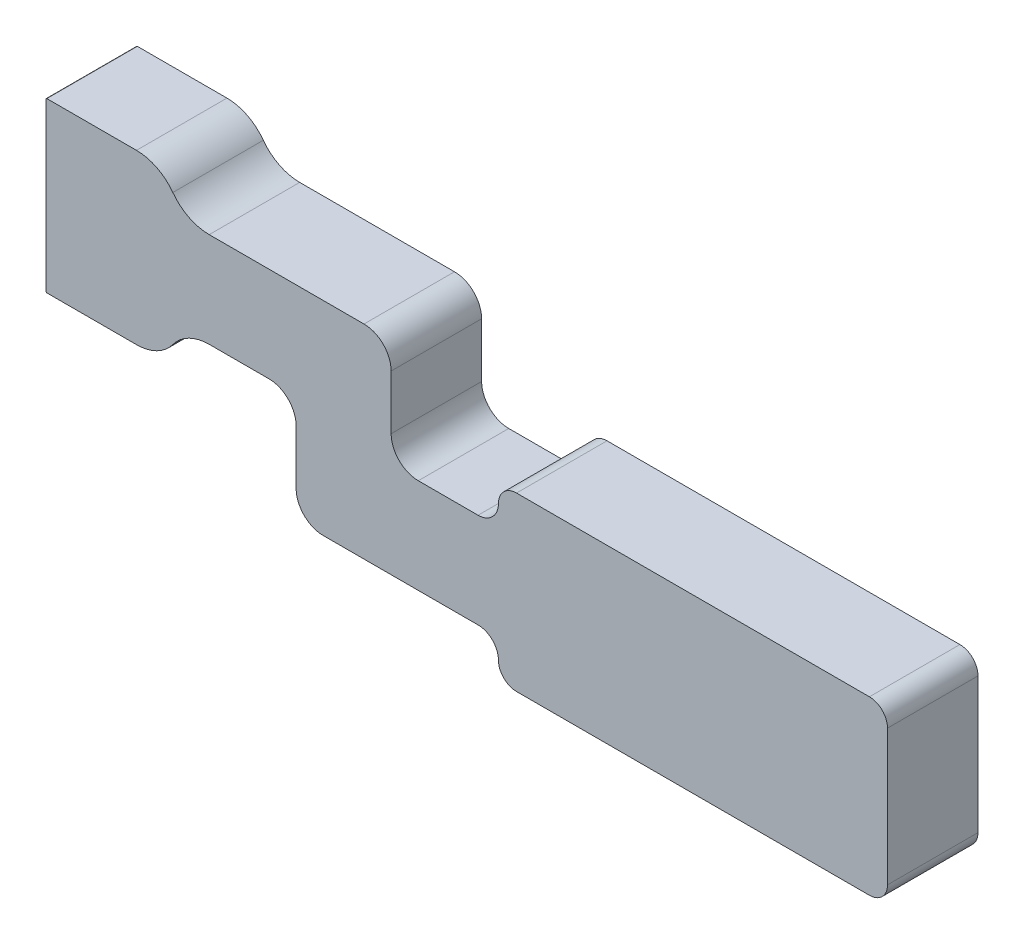
ISO-10303-21;
HEADER;
FILE_DESCRIPTION(('STEP AP214'),'2;1');
FILE_NAME('part.step','',(''),(''),'','','');
FILE_SCHEMA(('AUTOMOTIVE_DESIGN { 1 0 10303 214 1 1 1 1 }'));
ENDSEC;
DATA;
#1=APPLICATION_CONTEXT('core data for automotive mechanical design processes');
#2=APPLICATION_PROTOCOL_DEFINITION('international standard','automotive_design',2000,#1);
#3=PRODUCT_CONTEXT('',#1,'mechanical');
#4=PRODUCT('Part','Part','',(#3));
#5=PRODUCT_RELATED_PRODUCT_CATEGORY('part','',(#4));
#6=PRODUCT_DEFINITION_FORMATION('','',#4);
#7=PRODUCT_DEFINITION_CONTEXT('part definition',#1,'design');
#8=PRODUCT_DEFINITION('design','',#6,#7);
#9=PRODUCT_DEFINITION_SHAPE('','',#8);
#10=(LENGTH_UNIT() NAMED_UNIT(*) SI_UNIT(.MILLI.,.METRE.));
#11=(NAMED_UNIT(*) PLANE_ANGLE_UNIT() SI_UNIT($,.RADIAN.));
#12=(NAMED_UNIT(*) SI_UNIT($,.STERADIAN.) SOLID_ANGLE_UNIT());
#13=UNCERTAINTY_MEASURE_WITH_UNIT(LENGTH_MEASURE(1.E-05),#10,'distance_accuracy_value','');
#14=(GEOMETRIC_REPRESENTATION_CONTEXT(3) GLOBAL_UNCERTAINTY_ASSIGNED_CONTEXT((#13)) GLOBAL_UNIT_ASSIGNED_CONTEXT((#10,
#11,#12)) REPRESENTATION_CONTEXT('',''));
#15=CARTESIAN_POINT('',(0.,0.,0.));
#16=DIRECTION('',(0.,0.,1.));
#17=DIRECTION('',(1.,0.,0.));
#18=AXIS2_PLACEMENT_3D('',#15,#16,#17);
#19=CARTESIAN_POINT('',(0.,21.3,10.));
#20=DIRECTION('',(0.,-1.,0.));
#21=DIRECTION('',(0.,0.,-1.));
#22=AXIS2_PLACEMENT_3D('',#19,#20,#21);
#23=PLANE('',#22);
#24=DIRECTION('',(-1.,0.,0.));
#25=VECTOR('',#24,1.);
#26=CARTESIAN_POINT('',(0.,21.3,0.));
#27=LINE('',#26,#25);
#28=CARTESIAN_POINT('',(-83.,21.3,0.));
#29=VERTEX_POINT('',#28);
#30=CARTESIAN_POINT('',(-92.9,21.3,0.));
#31=VERTEX_POINT('',#30);
#32=EDGE_CURVE('E253',#29,#31,#27,.T.);
#33=ORIENTED_EDGE('',*,*,#32,.T.);
#34=DIRECTION('',(0.,0.,-1.));
#35=VECTOR('',#34,1.);
#36=CARTESIAN_POINT('',(-92.9,21.3,10.));
#37=LINE('',#36,#35);
#38=CARTESIAN_POINT('',(-92.9,21.3,10.));
#39=VERTEX_POINT('',#38);
#40=EDGE_CURVE('E11',#39,#31,#37,.T.);
#41=ORIENTED_EDGE('',*,*,#40,.F.);
#42=DIRECTION('',(-1.,0.,0.));
#43=VECTOR('',#42,1.);
#44=CARTESIAN_POINT('',(0.,21.3,10.));
#45=LINE('',#44,#43);
#46=CARTESIAN_POINT('',(-83.,21.3,10.));
#47=VERTEX_POINT('',#46);
#48=EDGE_CURVE('E322',#47,#39,#45,.T.);
#49=ORIENTED_EDGE('',*,*,#48,.F.);
#50=DIRECTION('',(0.,0.,-1.));
#51=VECTOR('',#50,1.);
#52=CARTESIAN_POINT('',(-83.,21.3,10.));
#53=LINE('',#52,#51);
#54=EDGE_CURVE('E252',#47,#29,#53,.T.);
#55=ORIENTED_EDGE('',*,*,#54,.T.);
#56=EDGE_LOOP('',(#33,#41,#49,#55));
#57=FACE_BOUND('',#56,.T.);
#58=ADVANCED_FACE('F39',(#57),#23,.F.);
#59=CARTESIAN_POINT('',(-92.9,21.2,10.));
#60=DIRECTION('',(0.,0.,-1.));
#61=DIRECTION('',(-1.,0.,0.));
#62=AXIS2_PLACEMENT_3D('',#59,#60,#61);
#63=CYLINDRICAL_SURFACE('',#62,0.100000000000008);
#64=CARTESIAN_POINT('',(-92.9,21.2,0.));
#65=DIRECTION('',(0.,0.,1.));
#66=DIRECTION('',(1.,0.,0.));
#67=AXIS2_PLACEMENT_3D('',#64,#65,#66);
#68=CIRCLE('',#67,0.100000000000008);
#69=CARTESIAN_POINT('',(-93.,21.2,0.));
#70=VERTEX_POINT('',#69);
#71=EDGE_CURVE('E256',#31,#70,#68,.T.);
#72=ORIENTED_EDGE('',*,*,#71,.T.);
#73=DIRECTION('',(0.,0.,-1.));
#74=VECTOR('',#73,1.);
#75=CARTESIAN_POINT('',(-93.,21.2,10.));
#76=LINE('',#75,#74);
#77=CARTESIAN_POINT('',(-93.,21.2,10.));
#78=VERTEX_POINT('',#77);
#79=EDGE_CURVE('E50',#78,#70,#76,.T.);
#80=ORIENTED_EDGE('',*,*,#79,.F.);
#81=CARTESIAN_POINT('',(-92.9,21.2,10.));
#82=DIRECTION('',(0.,0.,1.));
#83=DIRECTION('',(1.,0.,0.));
#84=AXIS2_PLACEMENT_3D('',#81,#82,#83);
#85=CIRCLE('',#84,0.100000000000008);
#86=EDGE_CURVE('E156',#39,#78,#85,.T.);
#87=ORIENTED_EDGE('',*,*,#86,.F.);
#88=ORIENTED_EDGE('',*,*,#40,.T.);
#89=EDGE_LOOP('',(#72,#80,#87,#88));
#90=FACE_BOUND('',#89,.T.);
#91=ADVANCED_FACE('F471',(#90),#63,.T.);
#92=CARTESIAN_POINT('',(-93.,0.,10.));
#93=DIRECTION('',(1.,0.,0.));
#94=DIRECTION('',(0.,0.,-1.));
#95=AXIS2_PLACEMENT_3D('',#92,#93,#94);
#96=PLANE('',#95);
#97=DIRECTION('',(0.,-1.,0.));
#98=VECTOR('',#97,1.);
#99=CARTESIAN_POINT('',(-93.,0.,0.));
#100=LINE('',#99,#98);
#101=CARTESIAN_POINT('',(-93.,2.80000000000004,0.));
#102=VERTEX_POINT('',#101);
#103=EDGE_CURVE('E259',#70,#102,#100,.T.);
#104=ORIENTED_EDGE('',*,*,#103,.T.);
#105=DIRECTION('',(0.,0.,-1.));
#106=VECTOR('',#105,1.);
#107=CARTESIAN_POINT('',(-93.,2.80000000000004,10.));
#108=LINE('',#107,#106);
#109=CARTESIAN_POINT('',(-93.,2.80000000000004,10.));
#110=VERTEX_POINT('',#109);
#111=EDGE_CURVE('E379',#110,#102,#108,.T.);
#112=ORIENTED_EDGE('',*,*,#111,.F.);
#113=DIRECTION('',(0.,-1.,0.));
#114=VECTOR('',#113,1.);
#115=CARTESIAN_POINT('',(-93.,0.,10.));
#116=LINE('',#115,#114);
#117=EDGE_CURVE('E384',#78,#110,#116,.T.);
#118=ORIENTED_EDGE('',*,*,#117,.F.);
#119=ORIENTED_EDGE('',*,*,#79,.T.);
#120=EDGE_LOOP('',(#104,#112,#118,#119));
#121=FACE_BOUND('',#120,.T.);
#122=ADVANCED_FACE('F385',(#121),#96,.F.);
#123=CARTESIAN_POINT('',(-92.9,2.80000000000004,10.));
#124=DIRECTION('',(0.,0.,-1.));
#125=DIRECTION('',(-1.,0.,0.));
#126=AXIS2_PLACEMENT_3D('',#123,#124,#125);
#127=CYLINDRICAL_SURFACE('',#126,0.100000000000008);
#128=CARTESIAN_POINT('',(-92.9,2.80000000000004,0.));
#129=DIRECTION('',(0.,0.,1.));
#130=DIRECTION('',(1.,0.,0.));
#131=AXIS2_PLACEMENT_3D('',#128,#129,#130);
#132=CIRCLE('',#131,0.100000000000008);
#133=CARTESIAN_POINT('',(-92.9,2.70000000000004,0.));
#134=VERTEX_POINT('',#133);
#135=EDGE_CURVE('E261',#134,#102,#132,.F.);
#136=ORIENTED_EDGE('',*,*,#135,.F.);
#137=DIRECTION('',(0.,0.,-1.));
#138=VECTOR('',#137,1.);
#139=CARTESIAN_POINT('',(-92.9,2.70000000000004,10.));
#140=LINE('',#139,#138);
#141=CARTESIAN_POINT('',(-92.9,2.70000000000004,10.));
#142=VERTEX_POINT('',#141);
#143=EDGE_CURVE('E373',#142,#134,#140,.T.);
#144=ORIENTED_EDGE('',*,*,#143,.F.);
#145=CARTESIAN_POINT('',(-92.9,2.80000000000004,10.));
#146=DIRECTION('',(0.,0.,1.));
#147=DIRECTION('',(1.,0.,0.));
#148=AXIS2_PLACEMENT_3D('',#145,#146,#147);
#149=CIRCLE('',#148,0.100000000000008);
#150=EDGE_CURVE('E395',#142,#110,#149,.F.);
#151=ORIENTED_EDGE('',*,*,#150,.T.);
#152=ORIENTED_EDGE('',*,*,#111,.T.);
#153=EDGE_LOOP('',(#136,#144,#151,#152));
#154=FACE_BOUND('',#153,.T.);
#155=ADVANCED_FACE('F393',(#154),#127,.T.);
#156=CARTESIAN_POINT('',(0.,2.70000000000005,10.));
#157=DIRECTION('',(0.,-1.,0.));
#158=DIRECTION('',(1.,0.,0.));
#159=AXIS2_PLACEMENT_3D('',#156,#157,#158);
#160=PLANE('',#159);
#161=DIRECTION('',(-1.,0.,0.));
#162=VECTOR('',#161,1.);
#163=CARTESIAN_POINT('',(0.,2.70000000000005,0.));
#164=LINE('',#163,#162);
#165=CARTESIAN_POINT('',(-83.,2.70000000000004,0.));
#166=VERTEX_POINT('',#165);
#167=EDGE_CURVE('E266',#166,#134,#164,.T.);
#168=ORIENTED_EDGE('',*,*,#167,.F.);
#169=DIRECTION('',(0.,0.,-1.));
#170=VECTOR('',#169,1.);
#171=CARTESIAN_POINT('',(-83.,2.70000000000004,10.));
#172=LINE('',#171,#170);
#173=CARTESIAN_POINT('',(-83.,2.70000000000004,10.));
#174=VERTEX_POINT('',#173);
#175=EDGE_CURVE('E374',#174,#166,#172,.T.);
#176=ORIENTED_EDGE('',*,*,#175,.F.);
#177=DIRECTION('',(-1.,0.,0.));
#178=VECTOR('',#177,1.);
#179=CARTESIAN_POINT('',(0.,2.70000000000005,10.));
#180=LINE('',#179,#178);
#181=EDGE_CURVE('E400',#174,#142,#180,.T.);
#182=ORIENTED_EDGE('',*,*,#181,.T.);
#183=ORIENTED_EDGE('',*,*,#143,.T.);
#184=EDGE_LOOP('',(#168,#176,#182,#183));
#185=FACE_BOUND('',#184,.T.);
#186=ADVANCED_FACE('F485',(#185),#160,.T.);
#187=CARTESIAN_POINT('',(-83.,7.70000000000004,10.));
#188=DIRECTION('',(0.,0.,-1.));
#189=DIRECTION('',(-1.,0.,0.));
#190=AXIS2_PLACEMENT_3D('',#187,#188,#189);
#191=CYLINDRICAL_SURFACE('',#190,5.00000000000001);
#192=CARTESIAN_POINT('',(-83.,7.70000000000004,0.));
#193=DIRECTION('',(0.,0.,1.));
#194=DIRECTION('',(1.,0.,0.));
#195=AXIS2_PLACEMENT_3D('',#192,#193,#194);
#196=CIRCLE('',#195,5.00000000000001);
#197=CARTESIAN_POINT('',(-78.9813715026144,4.72500000000004,0.));
#198=VERTEX_POINT('',#197);
#199=EDGE_CURVE('E267',#198,#166,#196,.F.);
#200=ORIENTED_EDGE('',*,*,#199,.F.);
#201=DIRECTION('',(0.,0.,-1.));
#202=VECTOR('',#201,1.);
#203=CARTESIAN_POINT('',(-78.9813715026144,4.72500000000004,10.));
#204=LINE('',#203,#202);
#205=CARTESIAN_POINT('',(-78.9813715026144,4.72500000000004,10.));
#206=VERTEX_POINT('',#205);
#207=EDGE_CURVE('E372',#206,#198,#204,.T.);
#208=ORIENTED_EDGE('',*,*,#207,.F.);
#209=CARTESIAN_POINT('',(-83.,7.70000000000004,10.));
#210=DIRECTION('',(0.,0.,1.));
#211=DIRECTION('',(1.,0.,0.));
#212=AXIS2_PLACEMENT_3D('',#209,#210,#211);
#213=CIRCLE('',#212,5.00000000000001);
#214=EDGE_CURVE('E399',#206,#174,#213,.F.);
#215=ORIENTED_EDGE('',*,*,#214,.T.);
#216=ORIENTED_EDGE('',*,*,#175,.T.);
#217=EDGE_LOOP('',(#200,#208,#215,#216));
#218=FACE_BOUND('',#217,.T.);
#219=ADVANCED_FACE('F490',(#218),#191,.T.);
#220=CARTESIAN_POINT('',(-74.9627430052287,1.75000000000004,10.));
#221=DIRECTION('',(0.,0.,-1.));
#222=DIRECTION('',(-1.,0.,0.));
#223=AXIS2_PLACEMENT_3D('',#220,#221,#222);
#224=CYLINDRICAL_SURFACE('',#223,4.99999999999999);
#225=CARTESIAN_POINT('',(-74.9627430052287,1.75000000000004,0.));
#226=DIRECTION('',(0.,0.,1.));
#227=DIRECTION('',(1.,0.,0.));
#228=AXIS2_PLACEMENT_3D('',#225,#226,#227);
#229=CIRCLE('',#228,4.99999999999999);
#230=CARTESIAN_POINT('',(-74.9627430052287,6.75000000000003,0.));
#231=VERTEX_POINT('',#230);
#232=EDGE_CURVE('E275',#231,#198,#229,.T.);
#233=ORIENTED_EDGE('',*,*,#232,.F.);
#234=DIRECTION('',(0.,0.,-1.));
#235=VECTOR('',#234,1.);
#236=CARTESIAN_POINT('',(-74.9627430052287,6.75000000000003,10.));
#237=LINE('',#236,#235);
#238=CARTESIAN_POINT('',(-74.9627430052287,6.75000000000003,10.));
#239=VERTEX_POINT('',#238);
#240=EDGE_CURVE('E368',#239,#231,#237,.T.);
#241=ORIENTED_EDGE('',*,*,#240,.F.);
#242=CARTESIAN_POINT('',(-74.9627430052287,1.75000000000004,10.));
#243=DIRECTION('',(0.,0.,1.));
#244=DIRECTION('',(1.,0.,0.));
#245=AXIS2_PLACEMENT_3D('',#242,#243,#244);
#246=CIRCLE('',#245,4.99999999999999);
#247=EDGE_CURVE('E406',#239,#206,#246,.T.);
#248=ORIENTED_EDGE('',*,*,#247,.T.);
#249=ORIENTED_EDGE('',*,*,#207,.T.);
#250=EDGE_LOOP('',(#233,#241,#248,#249));
#251=FACE_BOUND('',#250,.T.);
#252=ADVANCED_FACE('F491',(#251),#224,.F.);
#253=CARTESIAN_POINT('',(0.,6.75000000000002,10.));
#254=DIRECTION('',(0.,1.,0.));
#255=DIRECTION('',(-1.,0.,0.));
#256=AXIS2_PLACEMENT_3D('',#253,#254,#255);
#257=PLANE('',#256);
#258=DIRECTION('',(1.,0.,0.));
#259=VECTOR('',#258,1.);
#260=CARTESIAN_POINT('',(0.,6.75000000000002,0.));
#261=LINE('',#260,#259);
#262=CARTESIAN_POINT('',(-68.3563715026144,6.75000000000003,0.));
#263=VERTEX_POINT('',#262);
#264=EDGE_CURVE('E274',#231,#263,#261,.T.);
#265=ORIENTED_EDGE('',*,*,#264,.T.);
#266=DIRECTION('',(0.,0.,-1.));
#267=VECTOR('',#266,1.);
#268=CARTESIAN_POINT('',(-68.3563715026144,6.75000000000003,10.));
#269=LINE('',#268,#267);
#270=CARTESIAN_POINT('',(-68.3563715026144,6.75000000000003,10.));
#271=VERTEX_POINT('',#270);
#272=EDGE_CURVE('E370',#271,#263,#269,.T.);
#273=ORIENTED_EDGE('',*,*,#272,.F.);
#274=DIRECTION('',(1.,0.,0.));
#275=VECTOR('',#274,1.);
#276=CARTESIAN_POINT('',(0.,6.75000000000002,10.));
#277=LINE('',#276,#275);
#278=EDGE_CURVE('E407',#239,#271,#277,.T.);
#279=ORIENTED_EDGE('',*,*,#278,.F.);
#280=ORIENTED_EDGE('',*,*,#240,.T.);
#281=EDGE_LOOP('',(#265,#273,#279,#280));
#282=FACE_BOUND('',#281,.T.);
#283=ADVANCED_FACE('F494',(#282),#257,.F.);
#284=CARTESIAN_POINT('',(-68.3563715026144,3.75000000000003,10.));
#285=DIRECTION('',(0.,0.,-1.));
#286=DIRECTION('',(-1.,0.,0.));
#287=AXIS2_PLACEMENT_3D('',#284,#285,#286);
#288=CYLINDRICAL_SURFACE('',#287,2.99999999999999);
#289=CARTESIAN_POINT('',(-68.3563715026144,3.75000000000003,0.));
#290=DIRECTION('',(0.,0.,1.));
#291=DIRECTION('',(1.,0.,0.));
#292=AXIS2_PLACEMENT_3D('',#289,#290,#291);
#293=CIRCLE('',#292,2.99999999999999);
#294=CARTESIAN_POINT('',(-65.3563715026144,3.75000000000003,0.));
#295=VERTEX_POINT('',#294);
#296=EDGE_CURVE('E277',#295,#263,#293,.T.);
#297=ORIENTED_EDGE('',*,*,#296,.F.);
#298=DIRECTION('',(0.,0.,-1.));
#299=VECTOR('',#298,1.);
#300=CARTESIAN_POINT('',(-65.3563715026144,3.75000000000003,10.));
#301=LINE('',#300,#299);
#302=CARTESIAN_POINT('',(-65.3563715026144,3.75000000000003,10.));
#303=VERTEX_POINT('',#302);
#304=EDGE_CURVE('E364',#303,#295,#301,.T.);
#305=ORIENTED_EDGE('',*,*,#304,.F.);
#306=CARTESIAN_POINT('',(-68.3563715026144,3.75000000000003,10.));
#307=DIRECTION('',(0.,0.,1.));
#308=DIRECTION('',(1.,0.,0.));
#309=AXIS2_PLACEMENT_3D('',#306,#307,#308);
#310=CIRCLE('',#309,2.99999999999999);
#311=EDGE_CURVE('E411',#303,#271,#310,.T.);
#312=ORIENTED_EDGE('',*,*,#311,.T.);
#313=ORIENTED_EDGE('',*,*,#272,.T.);
#314=EDGE_LOOP('',(#297,#305,#312,#313));
#315=FACE_BOUND('',#314,.T.);
#316=ADVANCED_FACE('F497',(#315),#288,.F.);
#317=CARTESIAN_POINT('',(-65.3563715026144,0.,10.));
#318=DIRECTION('',(1.,0.,0.));
#319=DIRECTION('',(0.,0.,-1.));
#320=AXIS2_PLACEMENT_3D('',#317,#318,#319);
#321=PLANE('',#320);
#322=DIRECTION('',(0.,-1.,0.));
#323=VECTOR('',#322,1.);
#324=CARTESIAN_POINT('',(-65.3563715026144,0.,0.));
#325=LINE('',#324,#323);
#326=CARTESIAN_POINT('',(-65.3563715026144,-2.25000000000006,0.));
#327=VERTEX_POINT('',#326);
#328=EDGE_CURVE('E282',#295,#327,#325,.T.);
#329=ORIENTED_EDGE('',*,*,#328,.T.);
#330=DIRECTION('',(0.,0.,-1.));
#331=VECTOR('',#330,1.);
#332=CARTESIAN_POINT('',(-65.3563715026144,-2.25000000000006,10.));
#333=LINE('',#332,#331);
#334=CARTESIAN_POINT('',(-65.3563715026144,-2.25000000000006,10.));
#335=VERTEX_POINT('',#334);
#336=EDGE_CURVE('E363',#335,#327,#333,.T.);
#337=ORIENTED_EDGE('',*,*,#336,.F.);
#338=DIRECTION('',(0.,-1.,0.));
#339=VECTOR('',#338,1.);
#340=CARTESIAN_POINT('',(-65.3563715026144,0.,10.));
#341=LINE('',#340,#339);
#342=EDGE_CURVE('E413',#303,#335,#341,.T.);
#343=ORIENTED_EDGE('',*,*,#342,.F.);
#344=ORIENTED_EDGE('',*,*,#304,.T.);
#345=EDGE_LOOP('',(#329,#337,#343,#344));
#346=FACE_BOUND('',#345,.T.);
#347=ADVANCED_FACE('F502',(#346),#321,.F.);
#348=CARTESIAN_POINT('',(-62.3563715026144,-2.25000000000006,10.));
#349=DIRECTION('',(0.,0.,-1.));
#350=DIRECTION('',(-1.,0.,0.));
#351=AXIS2_PLACEMENT_3D('',#348,#349,#350);
#352=CYLINDRICAL_SURFACE('',#351,3.);
#353=CARTESIAN_POINT('',(-62.3563715026144,-2.25000000000006,0.));
#354=DIRECTION('',(0.,0.,1.));
#355=DIRECTION('',(1.,0.,0.));
#356=AXIS2_PLACEMENT_3D('',#353,#354,#355);
#357=CIRCLE('',#356,3.);
#358=CARTESIAN_POINT('',(-62.3563715026144,-5.25000000000006,0.));
#359=VERTEX_POINT('',#358);
#360=EDGE_CURVE('E281',#359,#327,#357,.F.);
#361=ORIENTED_EDGE('',*,*,#360,.F.);
#362=DIRECTION('',(0.,0.,-1.));
#363=VECTOR('',#362,1.);
#364=CARTESIAN_POINT('',(-62.3563715026144,-5.25000000000006,10.));
#365=LINE('',#364,#363);
#366=CARTESIAN_POINT('',(-62.3563715026144,-5.25000000000006,10.));
#367=VERTEX_POINT('',#366);
#368=EDGE_CURVE('E361',#367,#359,#365,.T.);
#369=ORIENTED_EDGE('',*,*,#368,.F.);
#370=CARTESIAN_POINT('',(-62.3563715026144,-2.25000000000006,10.));
#371=DIRECTION('',(0.,0.,1.));
#372=DIRECTION('',(1.,0.,0.));
#373=AXIS2_PLACEMENT_3D('',#370,#371,#372);
#374=CIRCLE('',#373,3.);
#375=EDGE_CURVE('E417',#367,#335,#374,.F.);
#376=ORIENTED_EDGE('',*,*,#375,.T.);
#377=ORIENTED_EDGE('',*,*,#336,.T.);
#378=EDGE_LOOP('',(#361,#369,#376,#377));
#379=FACE_BOUND('',#378,.T.);
#380=ADVANCED_FACE('F510',(#379),#352,.T.);
#381=CARTESIAN_POINT('',(0.,-5.25000000000005,10.));
#382=DIRECTION('',(0.,1.,0.));
#383=DIRECTION('',(-1.,0.,0.));
#384=AXIS2_PLACEMENT_3D('',#381,#382,#383);
#385=PLANE('',#384);
#386=DIRECTION('',(1.,0.,0.));
#387=VECTOR('',#386,1.);
#388=CARTESIAN_POINT('',(0.,-5.25000000000005,0.));
#389=LINE('',#388,#387);
#390=CARTESIAN_POINT('',(-45.2499999999999,-5.25000000000006,0.));
#391=VERTEX_POINT('',#390);
#392=EDGE_CURVE('E289',#359,#391,#389,.T.);
#393=ORIENTED_EDGE('',*,*,#392,.T.);
#394=DIRECTION('',(0.,0.,-1.));
#395=VECTOR('',#394,1.);
#396=CARTESIAN_POINT('',(-45.2499999999999,-5.25000000000006,10.));
#397=LINE('',#396,#395);
#398=CARTESIAN_POINT('',(-45.2499999999999,-5.25000000000006,10.));
#399=VERTEX_POINT('',#398);
#400=EDGE_CURVE('E358',#399,#391,#397,.T.);
#401=ORIENTED_EDGE('',*,*,#400,.F.);
#402=DIRECTION('',(1.,0.,0.));
#403=VECTOR('',#402,1.);
#404=CARTESIAN_POINT('',(0.,-5.25000000000005,10.));
#405=LINE('',#404,#403);
#406=EDGE_CURVE('E416',#367,#399,#405,.T.);
#407=ORIENTED_EDGE('',*,*,#406,.F.);
#408=ORIENTED_EDGE('',*,*,#368,.T.);
#409=EDGE_LOOP('',(#393,#401,#407,#408));
#410=FACE_BOUND('',#409,.T.);
#411=ADVANCED_FACE('F512',(#410),#385,.F.);
#412=CARTESIAN_POINT('',(-45.2499999999999,-7.49999999999998,10.));
#413=DIRECTION('',(0.,0.,-1.));
#414=DIRECTION('',(-1.,0.,0.));
#415=AXIS2_PLACEMENT_3D('',#412,#413,#414);
#416=CYLINDRICAL_SURFACE('',#415,2.24999999999998);
#417=CARTESIAN_POINT('',(-45.2499999999999,-7.49999999999998,0.));
#418=DIRECTION('',(0.,0.,1.));
#419=DIRECTION('',(1.,0.,0.));
#420=AXIS2_PLACEMENT_3D('',#417,#418,#419);
#421=CIRCLE('',#420,2.24999999999998);
#422=CARTESIAN_POINT('',(-43.,-7.49999999999996,0.));
#423=VERTEX_POINT('',#422);
#424=EDGE_CURVE('E286',#391,#423,#421,.F.);
#425=ORIENTED_EDGE('',*,*,#424,.T.);
#426=DIRECTION('',(0.,0.,-1.));
#427=VECTOR('',#426,1.);
#428=CARTESIAN_POINT('',(-43.,-7.49999999999996,10.));
#429=LINE('',#428,#427);
#430=CARTESIAN_POINT('',(-43.,-7.49999999999996,10.));
#431=VERTEX_POINT('',#430);
#432=EDGE_CURVE('E352',#431,#423,#429,.T.);
#433=ORIENTED_EDGE('',*,*,#432,.F.);
#434=CARTESIAN_POINT('',(-45.2499999999999,-7.49999999999998,10.));
#435=DIRECTION('',(0.,0.,1.));
#436=DIRECTION('',(1.,0.,0.));
#437=AXIS2_PLACEMENT_3D('',#434,#435,#436);
#438=CIRCLE('',#437,2.24999999999998);
#439=EDGE_CURVE('E422',#399,#431,#438,.F.);
#440=ORIENTED_EDGE('',*,*,#439,.F.);
#441=ORIENTED_EDGE('',*,*,#400,.T.);
#442=EDGE_LOOP('',(#425,#433,#440,#441));
#443=FACE_BOUND('',#442,.T.);
#444=ADVANCED_FACE('F513',(#443),#416,.F.);
#445=CARTESIAN_POINT('',(-41.,-7.49999999999998,10.));
#446=DIRECTION('',(0.,0.,-1.));
#447=DIRECTION('',(-1.,0.,0.));
#448=AXIS2_PLACEMENT_3D('',#445,#446,#447);
#449=CYLINDRICAL_SURFACE('',#448,2.);
#450=CARTESIAN_POINT('',(-41.,-7.49999999999998,0.));
#451=DIRECTION('',(0.,0.,1.));
#452=DIRECTION('',(1.,0.,0.));
#453=AXIS2_PLACEMENT_3D('',#450,#451,#452);
#454=CIRCLE('',#453,2.);
#455=CARTESIAN_POINT('',(-41.,-9.49999999999998,0.));
#456=VERTEX_POINT('',#455);
#457=EDGE_CURVE('E292',#423,#456,#454,.T.);
#458=ORIENTED_EDGE('',*,*,#457,.T.);
#459=DIRECTION('',(0.,0.,-1.));
#460=VECTOR('',#459,1.);
#461=CARTESIAN_POINT('',(-41.,-9.49999999999998,10.));
#462=LINE('',#461,#460);
#463=CARTESIAN_POINT('',(-41.,-9.49999999999998,10.));
#464=VERTEX_POINT('',#463);
#465=EDGE_CURVE('E355',#464,#456,#462,.T.);
#466=ORIENTED_EDGE('',*,*,#465,.F.);
#467=CARTESIAN_POINT('',(-41.,-7.49999999999998,10.));
#468=DIRECTION('',(0.,0.,1.));
#469=DIRECTION('',(1.,0.,0.));
#470=AXIS2_PLACEMENT_3D('',#467,#468,#469);
#471=CIRCLE('',#470,2.);
#472=EDGE_CURVE('E425',#431,#464,#471,.T.);
#473=ORIENTED_EDGE('',*,*,#472,.F.);
#474=ORIENTED_EDGE('',*,*,#432,.T.);
#475=EDGE_LOOP('',(#458,#466,#473,#474));
#476=FACE_BOUND('',#475,.T.);
#477=ADVANCED_FACE('F519',(#476),#449,.T.);
#478=CARTESIAN_POINT('',(0.,-9.5,10.));
#479=DIRECTION('',(0.,1.,0.));
#480=DIRECTION('',(-1.,0.,0.));
#481=AXIS2_PLACEMENT_3D('',#478,#479,#480);
#482=PLANE('',#481);
#483=DIRECTION('',(1.,0.,0.));
#484=VECTOR('',#483,1.);
#485=CARTESIAN_POINT('',(0.,-9.5,0.));
#486=LINE('',#485,#484);
#487=CARTESIAN_POINT('',(-2.00000000000001,-9.5,0.));
#488=VERTEX_POINT('',#487);
#489=EDGE_CURVE('E291',#456,#488,#486,.T.);
#490=ORIENTED_EDGE('',*,*,#489,.T.);
#491=DIRECTION('',(0.,0.,-1.));
#492=VECTOR('',#491,1.);
#493=CARTESIAN_POINT('',(-2.00000000000001,-9.5,10.));
#494=LINE('',#493,#492);
#495=CARTESIAN_POINT('',(-2.00000000000001,-9.5,10.));
#496=VERTEX_POINT('',#495);
#497=EDGE_CURVE('E350',#496,#488,#494,.T.);
#498=ORIENTED_EDGE('',*,*,#497,.F.);
#499=DIRECTION('',(1.,0.,0.));
#500=VECTOR('',#499,1.);
#501=CARTESIAN_POINT('',(0.,-9.5,10.));
#502=LINE('',#501,#500);
#503=EDGE_CURVE('E423',#464,#496,#502,.T.);
#504=ORIENTED_EDGE('',*,*,#503,.F.);
#505=ORIENTED_EDGE('',*,*,#465,.T.);
#506=EDGE_LOOP('',(#490,#498,#504,#505));
#507=FACE_BOUND('',#506,.T.);
#508=ADVANCED_FACE('F525',(#507),#482,.F.);
#509=CARTESIAN_POINT('',(-2.,-7.5,10.));
#510=DIRECTION('',(0.,0.,-1.));
#511=DIRECTION('',(-1.,0.,0.));
#512=AXIS2_PLACEMENT_3D('',#509,#510,#511);
#513=CYLINDRICAL_SURFACE('',#512,2.);
#514=CARTESIAN_POINT('',(-2.,-7.5,0.));
#515=DIRECTION('',(0.,0.,1.));
#516=DIRECTION('',(1.,0.,0.));
#517=AXIS2_PLACEMENT_3D('',#514,#515,#516);
#518=CIRCLE('',#517,2.);
#519=CARTESIAN_POINT('',(0.,-7.49999999999999,0.));
#520=VERTEX_POINT('',#519);
#521=EDGE_CURVE('E293',#488,#520,#518,.T.);
#522=ORIENTED_EDGE('',*,*,#521,.T.);
#523=DIRECTION('',(0.,0.,-1.));
#524=VECTOR('',#523,1.);
#525=CARTESIAN_POINT('',(0.,-7.49999999999999,10.));
#526=LINE('',#525,#524);
#527=CARTESIAN_POINT('',(0.,-7.49999999999999,10.));
#528=VERTEX_POINT('',#527);
#529=EDGE_CURVE('E348',#528,#520,#526,.T.);
#530=ORIENTED_EDGE('',*,*,#529,.F.);
#531=CARTESIAN_POINT('',(-2.,-7.5,10.));
#532=DIRECTION('',(0.,0.,1.));
#533=DIRECTION('',(1.,0.,0.));
#534=AXIS2_PLACEMENT_3D('',#531,#532,#533);
#535=CIRCLE('',#534,2.);
#536=EDGE_CURVE('E430',#496,#528,#535,.T.);
#537=ORIENTED_EDGE('',*,*,#536,.F.);
#538=ORIENTED_EDGE('',*,*,#497,.T.);
#539=EDGE_LOOP('',(#522,#530,#537,#538));
#540=FACE_BOUND('',#539,.T.);
#541=ADVANCED_FACE('F527',(#540),#513,.T.);
#542=CARTESIAN_POINT('',(0.,0.,10.));
#543=DIRECTION('',(-1.,0.,0.));
#544=DIRECTION('',(0.,0.,1.));
#545=AXIS2_PLACEMENT_3D('',#542,#543,#544);
#546=PLANE('',#545);
#547=DIRECTION('',(0.,1.,0.));
#548=VECTOR('',#547,1.);
#549=CARTESIAN_POINT('',(0.,0.,0.));
#550=LINE('',#549,#548);
#551=CARTESIAN_POINT('',(0.,7.49999999999999,0.));
#552=VERTEX_POINT('',#551);
#553=EDGE_CURVE('E299',#520,#552,#550,.T.);
#554=ORIENTED_EDGE('',*,*,#553,.T.);
#555=DIRECTION('',(0.,0.,-1.));
#556=VECTOR('',#555,1.);
#557=CARTESIAN_POINT('',(0.,7.49999999999999,10.));
#558=LINE('',#557,#556);
#559=CARTESIAN_POINT('',(0.,7.49999999999999,10.));
#560=VERTEX_POINT('',#559);
#561=EDGE_CURVE('E345',#560,#552,#558,.T.);
#562=ORIENTED_EDGE('',*,*,#561,.F.);
#563=DIRECTION('',(0.,1.,0.));
#564=VECTOR('',#563,1.);
#565=CARTESIAN_POINT('',(0.,0.,10.));
#566=LINE('',#565,#564);
#567=EDGE_CURVE('E429',#528,#560,#566,.T.);
#568=ORIENTED_EDGE('',*,*,#567,.F.);
#569=ORIENTED_EDGE('',*,*,#529,.T.);
#570=EDGE_LOOP('',(#554,#562,#568,#569));
#571=FACE_BOUND('',#570,.T.);
#572=ADVANCED_FACE('F533',(#571),#546,.F.);
#573=CARTESIAN_POINT('',(-2.,7.5,10.));
#574=DIRECTION('',(0.,0.,-1.));
#575=DIRECTION('',(-1.,0.,0.));
#576=AXIS2_PLACEMENT_3D('',#573,#574,#575);
#577=CYLINDRICAL_SURFACE('',#576,2.);
#578=CARTESIAN_POINT('',(-2.,7.5,0.));
#579=DIRECTION('',(0.,0.,1.));
#580=DIRECTION('',(1.,0.,0.));
#581=AXIS2_PLACEMENT_3D('',#578,#579,#580);
#582=CIRCLE('',#581,2.);
#583=CARTESIAN_POINT('',(-2.00000000000001,9.5,0.));
#584=VERTEX_POINT('',#583);
#585=EDGE_CURVE('E296',#552,#584,#582,.T.);
#586=ORIENTED_EDGE('',*,*,#585,.T.);
#587=DIRECTION('',(0.,0.,-1.));
#588=VECTOR('',#587,1.);
#589=CARTESIAN_POINT('',(-2.00000000000001,9.5,10.));
#590=LINE('',#589,#588);
#591=CARTESIAN_POINT('',(-2.00000000000001,9.5,10.));
#592=VERTEX_POINT('',#591);
#593=EDGE_CURVE('E342',#592,#584,#590,.T.);
#594=ORIENTED_EDGE('',*,*,#593,.F.);
#595=CARTESIAN_POINT('',(-2.,7.5,10.));
#596=DIRECTION('',(0.,0.,1.));
#597=DIRECTION('',(1.,0.,0.));
#598=AXIS2_PLACEMENT_3D('',#595,#596,#597);
#599=CIRCLE('',#598,2.);
#600=EDGE_CURVE('E432',#560,#592,#599,.T.);
#601=ORIENTED_EDGE('',*,*,#600,.F.);
#602=ORIENTED_EDGE('',*,*,#561,.T.);
#603=EDGE_LOOP('',(#586,#594,#601,#602));
#604=FACE_BOUND('',#603,.T.);
#605=ADVANCED_FACE('F532',(#604),#577,.T.);
#606=CARTESIAN_POINT('',(0.,9.5,10.));
#607=DIRECTION('',(0.,1.,0.));
#608=DIRECTION('',(-1.,0.,0.));
#609=AXIS2_PLACEMENT_3D('',#606,#607,#608);
#610=PLANE('',#609);
#611=DIRECTION('',(1.,0.,0.));
#612=VECTOR('',#611,1.);
#613=CARTESIAN_POINT('',(0.,9.5,0.));
#614=LINE('',#613,#612);
#615=CARTESIAN_POINT('',(-41.,9.49999999999995,0.));
#616=VERTEX_POINT('',#615);
#617=EDGE_CURVE('E302',#616,#584,#614,.T.);
#618=ORIENTED_EDGE('',*,*,#617,.F.);
#619=DIRECTION('',(0.,0.,-1.));
#620=VECTOR('',#619,1.);
#621=CARTESIAN_POINT('',(-41.,9.49999999999995,10.));
#622=LINE('',#621,#620);
#623=CARTESIAN_POINT('',(-41.,9.49999999999995,10.));
#624=VERTEX_POINT('',#623);
#625=EDGE_CURVE('E339',#624,#616,#622,.T.);
#626=ORIENTED_EDGE('',*,*,#625,.F.);
#627=DIRECTION('',(1.,0.,0.));
#628=VECTOR('',#627,1.);
#629=CARTESIAN_POINT('',(0.,9.5,10.));
#630=LINE('',#629,#628);
#631=EDGE_CURVE('E435',#624,#592,#630,.T.);
#632=ORIENTED_EDGE('',*,*,#631,.T.);
#633=ORIENTED_EDGE('',*,*,#593,.T.);
#634=EDGE_LOOP('',(#618,#626,#632,#633));
#635=FACE_BOUND('',#634,.T.);
#636=ADVANCED_FACE('F537',(#635),#610,.T.);
#637=CARTESIAN_POINT('',(-41.,7.50000000000003,10.));
#638=DIRECTION('',(0.,0.,-1.));
#639=DIRECTION('',(-1.,0.,0.));
#640=AXIS2_PLACEMENT_3D('',#637,#638,#639);
#641=CYLINDRICAL_SURFACE('',#640,1.99999999999996);
#642=CARTESIAN_POINT('',(-41.,7.50000000000003,0.));
#643=DIRECTION('',(0.,0.,1.));
#644=DIRECTION('',(1.,0.,0.));
#645=AXIS2_PLACEMENT_3D('',#642,#643,#644);
#646=CIRCLE('',#645,1.99999999999996);
#647=CARTESIAN_POINT('',(-43.,7.50000000000002,0.));
#648=VERTEX_POINT('',#647);
#649=EDGE_CURVE('E304',#648,#616,#646,.F.);
#650=ORIENTED_EDGE('',*,*,#649,.F.);
#651=DIRECTION('',(0.,0.,-1.));
#652=VECTOR('',#651,1.);
#653=CARTESIAN_POINT('',(-43.,7.50000000000002,10.));
#654=LINE('',#653,#652);
#655=CARTESIAN_POINT('',(-43.,7.50000000000002,10.));
#656=VERTEX_POINT('',#655);
#657=EDGE_CURVE('E340',#656,#648,#654,.T.);
#658=ORIENTED_EDGE('',*,*,#657,.F.);
#659=CARTESIAN_POINT('',(-41.,7.50000000000003,10.));
#660=DIRECTION('',(0.,0.,1.));
#661=DIRECTION('',(1.,0.,0.));
#662=AXIS2_PLACEMENT_3D('',#659,#660,#661);
#663=CIRCLE('',#662,1.99999999999996);
#664=EDGE_CURVE('E438',#656,#624,#663,.F.);
#665=ORIENTED_EDGE('',*,*,#664,.T.);
#666=ORIENTED_EDGE('',*,*,#625,.T.);
#667=EDGE_LOOP('',(#650,#658,#665,#666));
#668=FACE_BOUND('',#667,.T.);
#669=ADVANCED_FACE('F543',(#668),#641,.T.);
#670=CARTESIAN_POINT('',(-45.25,7.50000000000003,10.));
#671=DIRECTION('',(0.,0.,-1.));
#672=DIRECTION('',(-1.,0.,0.));
#673=AXIS2_PLACEMENT_3D('',#670,#671,#672);
#674=CYLINDRICAL_SURFACE('',#673,2.25000000000001);
#675=CARTESIAN_POINT('',(-45.25,7.50000000000003,0.));
#676=DIRECTION('',(0.,0.,1.));
#677=DIRECTION('',(1.,0.,0.));
#678=AXIS2_PLACEMENT_3D('',#675,#676,#677);
#679=CIRCLE('',#678,2.25000000000001);
#680=CARTESIAN_POINT('',(-45.25,5.25000000000003,0.));
#681=VERTEX_POINT('',#680);
#682=EDGE_CURVE('E306',#681,#648,#679,.T.);
#683=ORIENTED_EDGE('',*,*,#682,.F.);
#684=DIRECTION('',(0.,0.,-1.));
#685=VECTOR('',#684,1.);
#686=CARTESIAN_POINT('',(-45.25,5.25000000000003,10.));
#687=LINE('',#686,#685);
#688=CARTESIAN_POINT('',(-45.25,5.25000000000003,10.));
#689=VERTEX_POINT('',#688);
#690=EDGE_CURVE('E333',#689,#681,#687,.T.);
#691=ORIENTED_EDGE('',*,*,#690,.F.);
#692=CARTESIAN_POINT('',(-45.25,7.50000000000003,10.));
#693=DIRECTION('',(0.,0.,1.));
#694=DIRECTION('',(1.,0.,0.));
#695=AXIS2_PLACEMENT_3D('',#692,#693,#694);
#696=CIRCLE('',#695,2.25000000000001);
#697=EDGE_CURVE('E440',#689,#656,#696,.T.);
#698=ORIENTED_EDGE('',*,*,#697,.T.);
#699=ORIENTED_EDGE('',*,*,#657,.T.);
#700=EDGE_LOOP('',(#683,#691,#698,#699));
#701=FACE_BOUND('',#700,.T.);
#702=ADVANCED_FACE('F550',(#701),#674,.F.);
#703=CARTESIAN_POINT('',(0.,5.25,10.));
#704=DIRECTION('',(0.,1.,0.));
#705=DIRECTION('',(-1.,0.,0.));
#706=AXIS2_PLACEMENT_3D('',#703,#704,#705);
#707=PLANE('',#706);
#708=DIRECTION('',(1.,0.,0.));
#709=VECTOR('',#708,1.);
#710=CARTESIAN_POINT('',(0.,5.25,0.));
#711=LINE('',#710,#709);
#712=CARTESIAN_POINT('',(-51.8563715026144,5.25000000000003,0.));
#713=VERTEX_POINT('',#712);
#714=EDGE_CURVE('E311',#713,#681,#711,.T.);
#715=ORIENTED_EDGE('',*,*,#714,.F.);
#716=DIRECTION('',(0.,0.,-1.));
#717=VECTOR('',#716,1.);
#718=CARTESIAN_POINT('',(-51.8563715026144,5.25000000000003,10.));
#719=LINE('',#718,#717);
#720=CARTESIAN_POINT('',(-51.8563715026144,5.25000000000003,10.));
#721=VERTEX_POINT('',#720);
#722=EDGE_CURVE('E335',#721,#713,#719,.T.);
#723=ORIENTED_EDGE('',*,*,#722,.F.);
#724=DIRECTION('',(1.,0.,0.));
#725=VECTOR('',#724,1.);
#726=CARTESIAN_POINT('',(0.,5.25,10.));
#727=LINE('',#726,#725);
#728=EDGE_CURVE('E445',#721,#689,#727,.T.);
#729=ORIENTED_EDGE('',*,*,#728,.T.);
#730=ORIENTED_EDGE('',*,*,#690,.T.);
#731=EDGE_LOOP('',(#715,#723,#729,#730));
#732=FACE_BOUND('',#731,.T.);
#733=ADVANCED_FACE('F552',(#732),#707,.T.);
#734=CARTESIAN_POINT('',(-51.8563715026144,8.25000000000003,10.));
#735=DIRECTION('',(0.,0.,-1.));
#736=DIRECTION('',(-1.,0.,0.));
#737=AXIS2_PLACEMENT_3D('',#734,#735,#736);
#738=CYLINDRICAL_SURFACE('',#737,3.);
#739=CARTESIAN_POINT('',(-51.8563715026144,8.25000000000003,0.));
#740=DIRECTION('',(0.,0.,1.));
#741=DIRECTION('',(1.,0.,0.));
#742=AXIS2_PLACEMENT_3D('',#739,#740,#741);
#743=CIRCLE('',#742,3.);
#744=CARTESIAN_POINT('',(-54.8563715026144,8.25000000000003,0.));
#745=VERTEX_POINT('',#744);
#746=EDGE_CURVE('E312',#713,#745,#743,.F.);
#747=ORIENTED_EDGE('',*,*,#746,.T.);
#748=DIRECTION('',(0.,0.,-1.));
#749=VECTOR('',#748,1.);
#750=CARTESIAN_POINT('',(-54.8563715026144,8.25000000000003,10.));
#751=LINE('',#750,#749);
#752=CARTESIAN_POINT('',(-54.8563715026144,8.25000000000003,10.));
#753=VERTEX_POINT('',#752);
#754=EDGE_CURVE('E328',#753,#745,#751,.T.);
#755=ORIENTED_EDGE('',*,*,#754,.F.);
#756=CARTESIAN_POINT('',(-51.8563715026144,8.25000000000003,10.));
#757=DIRECTION('',(0.,0.,1.));
#758=DIRECTION('',(1.,0.,0.));
#759=AXIS2_PLACEMENT_3D('',#756,#757,#758);
#760=CIRCLE('',#759,3.);
#761=EDGE_CURVE('E442',#721,#753,#760,.F.);
#762=ORIENTED_EDGE('',*,*,#761,.F.);
#763=ORIENTED_EDGE('',*,*,#722,.T.);
#764=EDGE_LOOP('',(#747,#755,#762,#763));
#765=FACE_BOUND('',#764,.T.);
#766=ADVANCED_FACE('F553',(#765),#738,.F.);
#767=CARTESIAN_POINT('',(-54.8563715026144,0.,10.));
#768=DIRECTION('',(-1.,0.,0.));
#769=DIRECTION('',(0.,0.,1.));
#770=AXIS2_PLACEMENT_3D('',#767,#768,#769);
#771=PLANE('',#770);
#772=DIRECTION('',(0.,1.,0.));
#773=VECTOR('',#772,1.);
#774=CARTESIAN_POINT('',(-54.8563715026144,0.,0.));
#775=LINE('',#774,#773);
#776=CARTESIAN_POINT('',(-54.8563715026144,14.25,0.));
#777=VERTEX_POINT('',#776);
#778=EDGE_CURVE('E316',#745,#777,#775,.T.);
#779=ORIENTED_EDGE('',*,*,#778,.T.);
#780=DIRECTION('',(0.,0.,-1.));
#781=VECTOR('',#780,1.);
#782=CARTESIAN_POINT('',(-54.8563715026144,14.25,10.));
#783=LINE('',#782,#781);
#784=CARTESIAN_POINT('',(-54.8563715026144,14.25,10.));
#785=VERTEX_POINT('',#784);
#786=EDGE_CURVE('E330',#785,#777,#783,.T.);
#787=ORIENTED_EDGE('',*,*,#786,.F.);
#788=DIRECTION('',(0.,1.,0.));
#789=VECTOR('',#788,1.);
#790=CARTESIAN_POINT('',(-54.8563715026144,0.,10.));
#791=LINE('',#790,#789);
#792=EDGE_CURVE('E450',#753,#785,#791,.T.);
#793=ORIENTED_EDGE('',*,*,#792,.F.);
#794=ORIENTED_EDGE('',*,*,#754,.T.);
#795=EDGE_LOOP('',(#779,#787,#793,#794));
#796=FACE_BOUND('',#795,.T.);
#797=ADVANCED_FACE('F452',(#796),#771,.F.);
#798=CARTESIAN_POINT('',(-57.8563715026144,14.25,10.));
#799=DIRECTION('',(0.,0.,-1.));
#800=DIRECTION('',(-1.,0.,0.));
#801=AXIS2_PLACEMENT_3D('',#798,#799,#800);
#802=CYLINDRICAL_SURFACE('',#801,3.);
#803=CARTESIAN_POINT('',(-57.8563715026144,14.25,0.));
#804=DIRECTION('',(0.,0.,1.));
#805=DIRECTION('',(1.,0.,0.));
#806=AXIS2_PLACEMENT_3D('',#803,#804,#805);
#807=CIRCLE('',#806,3.);
#808=CARTESIAN_POINT('',(-57.8563715026144,17.25,0.));
#809=VERTEX_POINT('',#808);
#810=EDGE_CURVE('E318',#777,#809,#807,.T.);
#811=ORIENTED_EDGE('',*,*,#810,.T.);
#812=DIRECTION('',(0.,0.,-1.));
#813=VECTOR('',#812,1.);
#814=CARTESIAN_POINT('',(-57.8563715026144,17.25,10.));
#815=LINE('',#814,#813);
#816=CARTESIAN_POINT('',(-57.8563715026144,17.25,10.));
#817=VERTEX_POINT('',#816);
#818=EDGE_CURVE('E247',#817,#809,#815,.T.);
#819=ORIENTED_EDGE('',*,*,#818,.F.);
#820=CARTESIAN_POINT('',(-57.8563715026144,14.25,10.));
#821=DIRECTION('',(0.,0.,1.));
#822=DIRECTION('',(1.,0.,0.));
#823=AXIS2_PLACEMENT_3D('',#820,#821,#822);
#824=CIRCLE('',#823,3.);
#825=EDGE_CURVE('E240',#785,#817,#824,.T.);
#826=ORIENTED_EDGE('',*,*,#825,.F.);
#827=ORIENTED_EDGE('',*,*,#786,.T.);
#828=EDGE_LOOP('',(#811,#819,#826,#827));
#829=FACE_BOUND('',#828,.T.);
#830=ADVANCED_FACE('F457',(#829),#802,.T.);
#831=CARTESIAN_POINT('',(0.,17.25,10.));
#832=DIRECTION('',(0.,-1.,0.));
#833=DIRECTION('',(0.,0.,-1.));
#834=AXIS2_PLACEMENT_3D('',#831,#832,#833);
#835=PLANE('',#834);
#836=DIRECTION('',(-1.,0.,0.));
#837=VECTOR('',#836,1.);
#838=CARTESIAN_POINT('',(0.,17.25,0.));
#839=LINE('',#838,#837);
#840=CARTESIAN_POINT('',(-74.9627430052287,17.25,0.));
#841=VERTEX_POINT('',#840);
#842=EDGE_CURVE('E243',#809,#841,#839,.T.);
#843=ORIENTED_EDGE('',*,*,#842,.T.);
#844=DIRECTION('',(0.,0.,-1.));
#845=VECTOR('',#844,1.);
#846=CARTESIAN_POINT('',(-74.9627430052287,17.25,10.));
#847=LINE('',#846,#845);
#848=CARTESIAN_POINT('',(-74.9627430052287,17.25,10.));
#849=VERTEX_POINT('',#848);
#850=EDGE_CURVE('E244',#849,#841,#847,.T.);
#851=ORIENTED_EDGE('',*,*,#850,.F.);
#852=DIRECTION('',(-1.,0.,0.));
#853=VECTOR('',#852,1.);
#854=CARTESIAN_POINT('',(0.,17.25,10.));
#855=LINE('',#854,#853);
#856=EDGE_CURVE('E231',#817,#849,#855,.T.);
#857=ORIENTED_EDGE('',*,*,#856,.F.);
#858=ORIENTED_EDGE('',*,*,#818,.T.);
#859=EDGE_LOOP('',(#843,#851,#857,#858));
#860=FACE_BOUND('',#859,.T.);
#861=ADVANCED_FACE('F245',(#860),#835,.F.);
#862=CARTESIAN_POINT('',(-74.9627430052287,22.25,10.));
#863=DIRECTION('',(0.,0.,-1.));
#864=DIRECTION('',(-1.,0.,0.));
#865=AXIS2_PLACEMENT_3D('',#862,#863,#864);
#866=CYLINDRICAL_SURFACE('',#865,4.99999999999999);
#867=CARTESIAN_POINT('',(-74.9627430052287,22.25,0.));
#868=DIRECTION('',(0.,0.,1.));
#869=DIRECTION('',(1.,0.,0.));
#870=AXIS2_PLACEMENT_3D('',#867,#868,#869);
#871=CIRCLE('',#870,4.99999999999999);
#872=CARTESIAN_POINT('',(-78.9813715026144,19.275,0.));
#873=VERTEX_POINT('',#872);
#874=EDGE_CURVE('E143',#841,#873,#871,.F.);
#875=ORIENTED_EDGE('',*,*,#874,.T.);
#876=DIRECTION('',(0.,0.,-1.));
#877=VECTOR('',#876,1.);
#878=CARTESIAN_POINT('',(-78.9813715026144,19.275,10.));
#879=LINE('',#878,#877);
#880=CARTESIAN_POINT('',(-78.9813715026144,19.275,10.));
#881=VERTEX_POINT('',#880);
#882=EDGE_CURVE('E250',#881,#873,#879,.T.);
#883=ORIENTED_EDGE('',*,*,#882,.F.);
#884=CARTESIAN_POINT('',(-74.9627430052287,22.25,10.));
#885=DIRECTION('',(0.,0.,1.));
#886=DIRECTION('',(1.,0.,0.));
#887=AXIS2_PLACEMENT_3D('',#884,#885,#886);
#888=CIRCLE('',#887,4.99999999999999);
#889=EDGE_CURVE('E234',#849,#881,#888,.F.);
#890=ORIENTED_EDGE('',*,*,#889,.F.);
#891=ORIENTED_EDGE('',*,*,#850,.T.);
#892=EDGE_LOOP('',(#875,#883,#890,#891));
#893=FACE_BOUND('',#892,.T.);
#894=ADVANCED_FACE('F249',(#893),#866,.F.);
#895=CARTESIAN_POINT('',(-83.,16.3,10.));
#896=DIRECTION('',(0.,0.,-1.));
#897=DIRECTION('',(-1.,0.,0.));
#898=AXIS2_PLACEMENT_3D('',#895,#896,#897);
#899=CYLINDRICAL_SURFACE('',#898,5.00000000000001);
#900=CARTESIAN_POINT('',(-83.,16.3,0.));
#901=DIRECTION('',(0.,0.,1.));
#902=DIRECTION('',(1.,0.,0.));
#903=AXIS2_PLACEMENT_3D('',#900,#901,#902);
#904=CIRCLE('',#903,5.00000000000001);
#905=EDGE_CURVE('E148',#873,#29,#904,.T.);
#906=ORIENTED_EDGE('',*,*,#905,.T.);
#907=ORIENTED_EDGE('',*,*,#54,.F.);
#908=CARTESIAN_POINT('',(-83.,16.3,10.));
#909=DIRECTION('',(0.,0.,1.));
#910=DIRECTION('',(1.,0.,0.));
#911=AXIS2_PLACEMENT_3D('',#908,#909,#910);
#912=CIRCLE('',#911,5.00000000000001);
#913=EDGE_CURVE('E54',#881,#47,#912,.T.);
#914=ORIENTED_EDGE('',*,*,#913,.F.);
#915=ORIENTED_EDGE('',*,*,#882,.T.);
#916=EDGE_LOOP('',(#906,#907,#914,#915));
#917=FACE_BOUND('',#916,.T.);
#918=ADVANCED_FACE('F465',(#917),#899,.T.);
#919=CARTESIAN_POINT('',(0.,0.,10.));
#920=DIRECTION('',(0.,0.,1.));
#921=DIRECTION('',(1.,0.,0.));
#922=AXIS2_PLACEMENT_3D('',#919,#920,#921);
#923=PLANE('',#922);
#924=ORIENTED_EDGE('',*,*,#48,.T.);
#925=ORIENTED_EDGE('',*,*,#86,.T.);
#926=ORIENTED_EDGE('',*,*,#117,.T.);
#927=ORIENTED_EDGE('',*,*,#150,.F.);
#928=ORIENTED_EDGE('',*,*,#181,.F.);
#929=ORIENTED_EDGE('',*,*,#214,.F.);
#930=ORIENTED_EDGE('',*,*,#247,.F.);
#931=ORIENTED_EDGE('',*,*,#278,.T.);
#932=ORIENTED_EDGE('',*,*,#311,.F.);
#933=ORIENTED_EDGE('',*,*,#342,.T.);
#934=ORIENTED_EDGE('',*,*,#375,.F.);
#935=ORIENTED_EDGE('',*,*,#406,.T.);
#936=ORIENTED_EDGE('',*,*,#439,.T.);
#937=ORIENTED_EDGE('',*,*,#472,.T.);
#938=ORIENTED_EDGE('',*,*,#503,.T.);
#939=ORIENTED_EDGE('',*,*,#536,.T.);
#940=ORIENTED_EDGE('',*,*,#567,.T.);
#941=ORIENTED_EDGE('',*,*,#600,.T.);
#942=ORIENTED_EDGE('',*,*,#631,.F.);
#943=ORIENTED_EDGE('',*,*,#664,.F.);
#944=ORIENTED_EDGE('',*,*,#697,.F.);
#945=ORIENTED_EDGE('',*,*,#728,.F.);
#946=ORIENTED_EDGE('',*,*,#761,.T.);
#947=ORIENTED_EDGE('',*,*,#792,.T.);
#948=ORIENTED_EDGE('',*,*,#825,.T.);
#949=ORIENTED_EDGE('',*,*,#856,.T.);
#950=ORIENTED_EDGE('',*,*,#889,.T.);
#951=ORIENTED_EDGE('',*,*,#913,.T.);
#952=EDGE_LOOP('',(#924,#925,#926,#927,#928,#929,#930,#931,#932,#933,#934,#935,#936,#937,#938,
#939,#940,#941,#942,#943,#944,#945,#946,#947,#948,#949,#950,#951));
#953=FACE_BOUND('',#952,.T.);
#954=ADVANCED_FACE('F232',(#953),#923,.T.);
#955=CARTESIAN_POINT('',(0.,0.,0.));
#956=DIRECTION('',(0.,0.,1.));
#957=DIRECTION('',(1.,0.,0.));
#958=AXIS2_PLACEMENT_3D('',#955,#956,#957);
#959=PLANE('',#958);
#960=ORIENTED_EDGE('',*,*,#32,.F.);
#961=ORIENTED_EDGE('',*,*,#905,.F.);
#962=ORIENTED_EDGE('',*,*,#874,.F.);
#963=ORIENTED_EDGE('',*,*,#842,.F.);
#964=ORIENTED_EDGE('',*,*,#810,.F.);
#965=ORIENTED_EDGE('',*,*,#778,.F.);
#966=ORIENTED_EDGE('',*,*,#746,.F.);
#967=ORIENTED_EDGE('',*,*,#714,.T.);
#968=ORIENTED_EDGE('',*,*,#682,.T.);
#969=ORIENTED_EDGE('',*,*,#649,.T.);
#970=ORIENTED_EDGE('',*,*,#617,.T.);
#971=ORIENTED_EDGE('',*,*,#585,.F.);
#972=ORIENTED_EDGE('',*,*,#553,.F.);
#973=ORIENTED_EDGE('',*,*,#521,.F.);
#974=ORIENTED_EDGE('',*,*,#489,.F.);
#975=ORIENTED_EDGE('',*,*,#457,.F.);
#976=ORIENTED_EDGE('',*,*,#424,.F.);
#977=ORIENTED_EDGE('',*,*,#392,.F.);
#978=ORIENTED_EDGE('',*,*,#360,.T.);
#979=ORIENTED_EDGE('',*,*,#328,.F.);
#980=ORIENTED_EDGE('',*,*,#296,.T.);
#981=ORIENTED_EDGE('',*,*,#264,.F.);
#982=ORIENTED_EDGE('',*,*,#232,.T.);
#983=ORIENTED_EDGE('',*,*,#199,.T.);
#984=ORIENTED_EDGE('',*,*,#167,.T.);
#985=ORIENTED_EDGE('',*,*,#135,.T.);
#986=ORIENTED_EDGE('',*,*,#103,.F.);
#987=ORIENTED_EDGE('',*,*,#71,.F.);
#988=EDGE_LOOP('',(#960,#961,#962,#963,#964,#965,#966,#967,#968,#969,#970,#971,#972,#973,#974,
#975,#976,#977,#978,#979,#980,#981,#982,#983,#984,#985,#986,#987));
#989=FACE_BOUND('',#988,.T.);
#990=ADVANCED_FACE('F389',(#989),#959,.F.);
#991=CLOSED_SHELL('',(#58,#91,#122,#155,#186,#219,#252,#283,#316,#347,#380,#411,#444,#477,#508,
#541,#572,#605,#636,#669,#702,#733,#766,#797,#830,#861,#894,#918,#954,#990));
#992=MANIFOLD_SOLID_BREP('B2',#991);
#993=ADVANCED_BREP_SHAPE_REPRESENTATION('',(#18,#992),#14);
#994=SHAPE_DEFINITION_REPRESENTATION(#9,#993);
ENDSEC;
END-ISO-10303-21;
